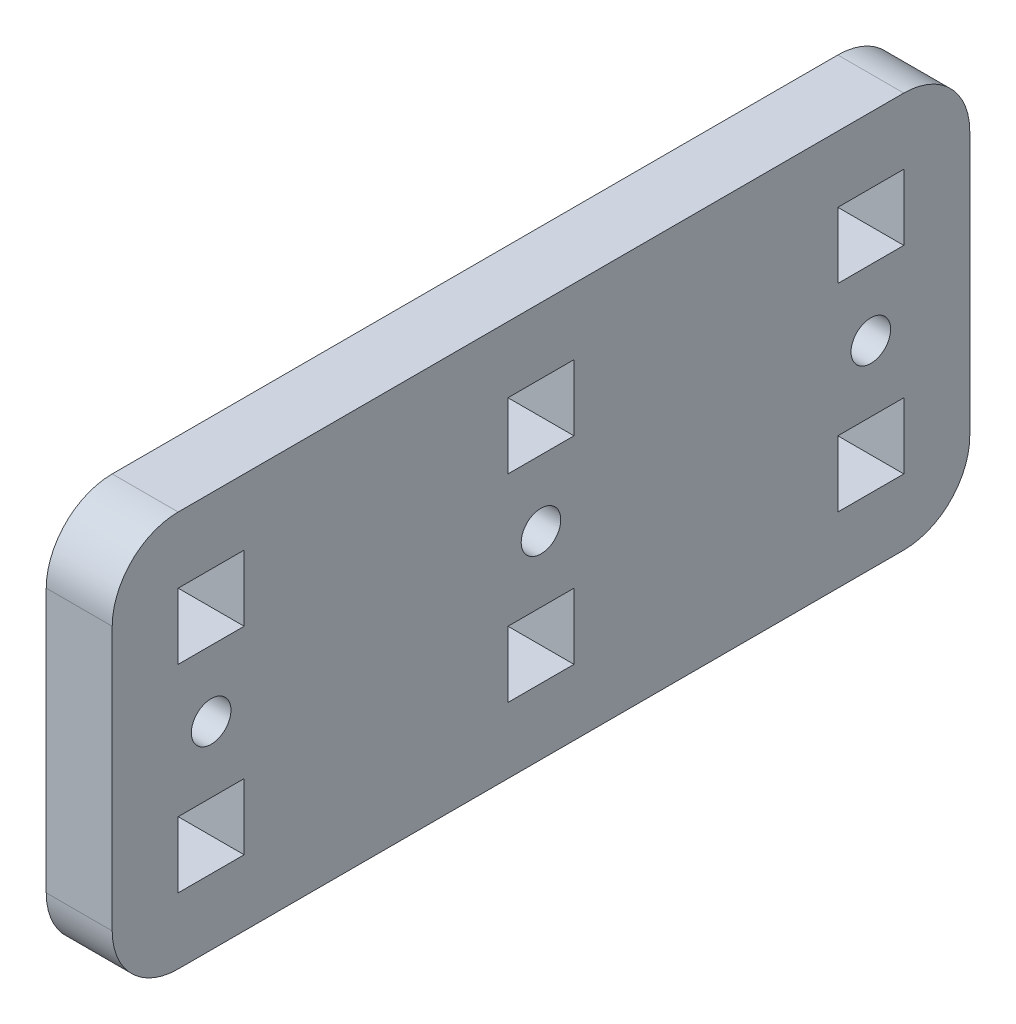
ISO-10303-21;
HEADER;
FILE_DESCRIPTION(('STEP AP214'),'2;1');
FILE_NAME('part.step','',(''),(''),'','','');
FILE_SCHEMA(('AUTOMOTIVE_DESIGN { 1 0 10303 214 1 1 1 1 }'));
ENDSEC;
DATA;
#1=APPLICATION_CONTEXT('core data for automotive mechanical design processes');
#2=APPLICATION_PROTOCOL_DEFINITION('international standard','automotive_design',2000,#1);
#3=PRODUCT_CONTEXT('',#1,'mechanical');
#4=PRODUCT('Part','Part','',(#3));
#5=PRODUCT_RELATED_PRODUCT_CATEGORY('part','',(#4));
#6=PRODUCT_DEFINITION_FORMATION('','',#4);
#7=PRODUCT_DEFINITION_CONTEXT('part definition',#1,'design');
#8=PRODUCT_DEFINITION('design','',#6,#7);
#9=PRODUCT_DEFINITION_SHAPE('','',#8);
#10=(LENGTH_UNIT() NAMED_UNIT(*) SI_UNIT(.MILLI.,.METRE.));
#11=(NAMED_UNIT(*) PLANE_ANGLE_UNIT() SI_UNIT($,.RADIAN.));
#12=(NAMED_UNIT(*) SI_UNIT($,.STERADIAN.) SOLID_ANGLE_UNIT());
#13=UNCERTAINTY_MEASURE_WITH_UNIT(LENGTH_MEASURE(1.E-05),#10,'distance_accuracy_value','');
#14=(GEOMETRIC_REPRESENTATION_CONTEXT(3) GLOBAL_UNCERTAINTY_ASSIGNED_CONTEXT((#13)) GLOBAL_UNIT_ASSIGNED_CONTEXT((#10,
#11,#12)) REPRESENTATION_CONTEXT('',''));
#15=CARTESIAN_POINT('',(0.,0.,0.));
#16=DIRECTION('',(0.,0.,1.));
#17=DIRECTION('',(1.,0.,0.));
#18=AXIS2_PLACEMENT_3D('',#15,#16,#17);
#19=CARTESIAN_POINT('',(5.,0.,0.));
#20=DIRECTION('',(-1.,0.,0.));
#21=DIRECTION('',(0.,0.,1.));
#22=AXIS2_PLACEMENT_3D('',#19,#20,#21);
#23=PLANE('',#22);
#24=DIRECTION('',(0.,0.,-1.));
#25=VECTOR('',#24,1.);
#26=CARTESIAN_POINT('',(4.99999999999997,20.,-30.));
#27=LINE('',#26,#25);
#28=CARTESIAN_POINT('',(4.99999999999997,20.,-30.));
#29=VERTEX_POINT('',#28);
#30=CARTESIAN_POINT('',(5.,20.,-35.));
#31=VERTEX_POINT('',#30);
#32=EDGE_CURVE('E287',#29,#31,#27,.T.);
#33=ORIENTED_EDGE('',*,*,#32,.F.);
#34=DIRECTION('',(0.,-1.,0.));
#35=VECTOR('',#34,1.);
#36=CARTESIAN_POINT('',(4.99999999999997,20.,-30.));
#37=LINE('',#36,#35);
#38=CARTESIAN_POINT('',(5.,25.,-30.));
#39=VERTEX_POINT('',#38);
#40=EDGE_CURVE('E295',#39,#29,#37,.T.);
#41=ORIENTED_EDGE('',*,*,#40,.F.);
#42=DIRECTION('',(0.,0.,1.));
#43=VECTOR('',#42,1.);
#44=CARTESIAN_POINT('',(4.99999999999997,25.,-30.));
#45=LINE('',#44,#43);
#46=CARTESIAN_POINT('',(5.,25.,-35.));
#47=VERTEX_POINT('',#46);
#48=EDGE_CURVE('E292',#47,#39,#45,.T.);
#49=ORIENTED_EDGE('',*,*,#48,.F.);
#50=DIRECTION('',(0.,1.,0.));
#51=VECTOR('',#50,1.);
#52=CARTESIAN_POINT('',(5.,20.,-35.));
#53=LINE('',#52,#51);
#54=EDGE_CURVE('E289',#31,#47,#53,.T.);
#55=ORIENTED_EDGE('',*,*,#54,.F.);
#56=EDGE_LOOP('',(#33,#41,#49,#55));
#57=FACE_BOUND('',#56,.T.);
#58=DIRECTION('',(0.,0.,-1.));
#59=VECTOR('',#58,1.);
#60=CARTESIAN_POINT('',(5.00000000000002,20.,-55.));
#61=LINE('',#60,#59);
#62=CARTESIAN_POINT('',(5.00000000000002,20.,-55.));
#63=VERTEX_POINT('',#62);
#64=CARTESIAN_POINT('',(5.00000000000005,20.,-60.));
#65=VERTEX_POINT('',#64);
#66=EDGE_CURVE('E355',#63,#65,#61,.T.);
#67=ORIENTED_EDGE('',*,*,#66,.F.);
#68=DIRECTION('',(0.,-1.,0.));
#69=VECTOR('',#68,1.);
#70=CARTESIAN_POINT('',(5.00000000000002,20.,-55.));
#71=LINE('',#70,#69);
#72=CARTESIAN_POINT('',(5.,25.,-55.));
#73=VERTEX_POINT('',#72);
#74=EDGE_CURVE('E363',#73,#63,#71,.T.);
#75=ORIENTED_EDGE('',*,*,#74,.F.);
#76=DIRECTION('',(0.,0.,1.));
#77=VECTOR('',#76,1.);
#78=CARTESIAN_POINT('',(5.00000000000002,25.,-55.));
#79=LINE('',#78,#77);
#80=CARTESIAN_POINT('',(5.00000000000005,25.,-60.));
#81=VERTEX_POINT('',#80);
#82=EDGE_CURVE('E360',#81,#73,#79,.T.);
#83=ORIENTED_EDGE('',*,*,#82,.F.);
#84=DIRECTION('',(0.,1.,0.));
#85=VECTOR('',#84,1.);
#86=CARTESIAN_POINT('',(5.00000000000005,20.,-60.));
#87=LINE('',#86,#85);
#88=EDGE_CURVE('E357',#65,#81,#87,.T.);
#89=ORIENTED_EDGE('',*,*,#88,.F.);
#90=EDGE_LOOP('',(#67,#75,#83,#89));
#91=FACE_BOUND('',#90,.T.);
#92=DIRECTION('',(0.,0.,-1.));
#93=VECTOR('',#92,1.);
#94=CARTESIAN_POINT('',(5.,20.,-10.));
#95=LINE('',#94,#93);
#96=CARTESIAN_POINT('',(5.,20.,-5.));
#97=VERTEX_POINT('',#96);
#98=CARTESIAN_POINT('',(5.,20.,-10.));
#99=VERTEX_POINT('',#98);
#100=EDGE_CURVE('E423',#97,#99,#95,.T.);
#101=ORIENTED_EDGE('',*,*,#100,.F.);
#102=DIRECTION('',(0.,-1.,0.));
#103=VECTOR('',#102,1.);
#104=CARTESIAN_POINT('',(5.,20.,-5.));
#105=LINE('',#104,#103);
#106=CARTESIAN_POINT('',(5.,25.,-5.));
#107=VERTEX_POINT('',#106);
#108=EDGE_CURVE('E431',#107,#97,#105,.T.);
#109=ORIENTED_EDGE('',*,*,#108,.F.);
#110=DIRECTION('',(0.,0.,1.));
#111=VECTOR('',#110,1.);
#112=CARTESIAN_POINT('',(5.,25.,-10.));
#113=LINE('',#112,#111);
#114=CARTESIAN_POINT('',(5.,25.,-10.));
#115=VERTEX_POINT('',#114);
#116=EDGE_CURVE('E428',#115,#107,#113,.T.);
#117=ORIENTED_EDGE('',*,*,#116,.F.);
#118=DIRECTION('',(0.,1.,0.));
#119=VECTOR('',#118,1.);
#120=CARTESIAN_POINT('',(5.,20.,-10.));
#121=LINE('',#120,#119);
#122=EDGE_CURVE('E425',#99,#115,#121,.T.);
#123=ORIENTED_EDGE('',*,*,#122,.F.);
#124=EDGE_LOOP('',(#101,#109,#117,#123));
#125=FACE_BOUND('',#124,.T.);
#126=DIRECTION('',(0.,0.,-1.));
#127=VECTOR('',#126,1.);
#128=CARTESIAN_POINT('',(5.,0.,0.));
#129=LINE('',#128,#127);
#130=CARTESIAN_POINT('',(5.,0.,-5.));
#131=VERTEX_POINT('',#130);
#132=CARTESIAN_POINT('',(5.,0.,-60.));
#133=VERTEX_POINT('',#132);
#134=EDGE_CURVE('E457',#131,#133,#129,.T.);
#135=ORIENTED_EDGE('',*,*,#134,.T.);
#136=CARTESIAN_POINT('',(5.,5.00000000000001,-60.));
#137=DIRECTION('',(-1.,0.,0.));
#138=DIRECTION('',(0.,0.,1.));
#139=AXIS2_PLACEMENT_3D('',#136,#137,#138);
#140=CIRCLE('',#139,5.);
#141=CARTESIAN_POINT('',(5.,5.00000000000001,-65.));
#142=VERTEX_POINT('',#141);
#143=EDGE_CURVE('E497',#133,#142,#140,.F.);
#144=ORIENTED_EDGE('',*,*,#143,.T.);
#145=DIRECTION('',(0.,1.,0.));
#146=VECTOR('',#145,1.);
#147=CARTESIAN_POINT('',(5.,0.,-65.));
#148=LINE('',#147,#146);
#149=CARTESIAN_POINT('',(5.,25.,-65.));
#150=VERTEX_POINT('',#149);
#151=EDGE_CURVE('E461',#142,#150,#148,.T.);
#152=ORIENTED_EDGE('',*,*,#151,.T.);
#153=CARTESIAN_POINT('',(5.,25.,-60.));
#154=DIRECTION('',(-1.,0.,0.));
#155=DIRECTION('',(0.,0.,1.));
#156=AXIS2_PLACEMENT_3D('',#153,#154,#155);
#157=CIRCLE('',#156,5.);
#158=CARTESIAN_POINT('',(5.,30.,-60.));
#159=VERTEX_POINT('',#158);
#160=EDGE_CURVE('E54',#150,#159,#157,.F.);
#161=ORIENTED_EDGE('',*,*,#160,.T.);
#162=DIRECTION('',(0.,0.,1.));
#163=VECTOR('',#162,1.);
#164=CARTESIAN_POINT('',(5.,30.,0.));
#165=LINE('',#164,#163);
#166=CARTESIAN_POINT('',(5.,30.,-5.));
#167=VERTEX_POINT('',#166);
#168=EDGE_CURVE('E463',#159,#167,#165,.T.);
#169=ORIENTED_EDGE('',*,*,#168,.T.);
#170=CARTESIAN_POINT('',(5.,25.,-5.));
#171=DIRECTION('',(-1.,0.,0.));
#172=DIRECTION('',(0.,0.,1.));
#173=AXIS2_PLACEMENT_3D('',#170,#171,#172);
#174=CIRCLE('',#173,5.);
#175=CARTESIAN_POINT('',(5.,25.,0.));
#176=VERTEX_POINT('',#175);
#177=EDGE_CURVE('E492',#167,#176,#174,.F.);
#178=ORIENTED_EDGE('',*,*,#177,.T.);
#179=DIRECTION('',(0.,-1.,0.));
#180=VECTOR('',#179,1.);
#181=CARTESIAN_POINT('',(5.,0.,0.));
#182=LINE('',#181,#180);
#183=CARTESIAN_POINT('',(5.,5.,0.));
#184=VERTEX_POINT('',#183);
#185=EDGE_CURVE('E454',#176,#184,#182,.T.);
#186=ORIENTED_EDGE('',*,*,#185,.T.);
#187=CARTESIAN_POINT('',(5.,5.,-5.));
#188=DIRECTION('',(-1.,0.,0.));
#189=DIRECTION('',(0.,0.,1.));
#190=AXIS2_PLACEMENT_3D('',#187,#188,#189);
#191=CIRCLE('',#190,5.);
#192=EDGE_CURVE('E494',#184,#131,#191,.F.);
#193=ORIENTED_EDGE('',*,*,#192,.T.);
#194=EDGE_LOOP('',(#135,#144,#152,#161,#169,#178,#186,#193));
#195=FACE_BOUND('',#194,.T.);
#196=DIRECTION('',(0.,0.,1.));
#197=VECTOR('',#196,1.);
#198=CARTESIAN_POINT('',(5.,10.,-10.));
#199=LINE('',#198,#197);
#200=CARTESIAN_POINT('',(5.,10.,-10.));
#201=VERTEX_POINT('',#200);
#202=CARTESIAN_POINT('',(5.,10.,-5.));
#203=VERTEX_POINT('',#202);
#204=EDGE_CURVE('E392',#201,#203,#199,.T.);
#205=ORIENTED_EDGE('',*,*,#204,.F.);
#206=DIRECTION('',(0.,1.,0.));
#207=VECTOR('',#206,1.);
#208=CARTESIAN_POINT('',(5.,10.,-10.));
#209=LINE('',#208,#207);
#210=CARTESIAN_POINT('',(5.,5.,-10.));
#211=VERTEX_POINT('',#210);
#212=EDGE_CURVE('E400',#211,#201,#209,.T.);
#213=ORIENTED_EDGE('',*,*,#212,.F.);
#214=DIRECTION('',(0.,0.,-1.));
#215=VECTOR('',#214,1.);
#216=CARTESIAN_POINT('',(5.,5.,-10.));
#217=LINE('',#216,#215);
#218=CARTESIAN_POINT('',(5.,5.,-5.));
#219=VERTEX_POINT('',#218);
#220=EDGE_CURVE('E397',#219,#211,#217,.T.);
#221=ORIENTED_EDGE('',*,*,#220,.F.);
#222=DIRECTION('',(0.,-1.,0.));
#223=VECTOR('',#222,1.);
#224=CARTESIAN_POINT('',(5.,10.,-5.));
#225=LINE('',#224,#223);
#226=EDGE_CURVE('E394',#203,#219,#225,.T.);
#227=ORIENTED_EDGE('',*,*,#226,.F.);
#228=EDGE_LOOP('',(#205,#213,#221,#227));
#229=FACE_BOUND('',#228,.T.);
#230=CARTESIAN_POINT('',(5.,15.,-7.5));
#231=DIRECTION('',(1.,0.,0.));
#232=DIRECTION('',(0.,0.,-1.));
#233=AXIS2_PLACEMENT_3D('',#230,#231,#232);
#234=CIRCLE('',#233,1.5);
#235=CARTESIAN_POINT('',(5.,15.,-9.));
#236=VERTEX_POINT('',#235);
#237=EDGE_CURVE('E386',#236,#236,#234,.T.);
#238=ORIENTED_EDGE('',*,*,#237,.F.);
#239=EDGE_LOOP('',(#238));
#240=FACE_BOUND('',#239,.T.);
#241=DIRECTION('',(0.,0.,1.));
#242=VECTOR('',#241,1.);
#243=CARTESIAN_POINT('',(5.00000000000002,10.,-55.));
#244=LINE('',#243,#242);
#245=CARTESIAN_POINT('',(5.00000000000005,10.,-60.));
#246=VERTEX_POINT('',#245);
#247=CARTESIAN_POINT('',(5.00000000000002,10.,-55.));
#248=VERTEX_POINT('',#247);
#249=EDGE_CURVE('E324',#246,#248,#244,.T.);
#250=ORIENTED_EDGE('',*,*,#249,.F.);
#251=DIRECTION('',(0.,1.,0.));
#252=VECTOR('',#251,1.);
#253=CARTESIAN_POINT('',(5.00000000000005,10.,-60.));
#254=LINE('',#253,#252);
#255=CARTESIAN_POINT('',(5.,5.,-60.));
#256=VERTEX_POINT('',#255);
#257=EDGE_CURVE('E332',#256,#246,#254,.T.);
#258=ORIENTED_EDGE('',*,*,#257,.F.);
#259=DIRECTION('',(0.,0.,-1.));
#260=VECTOR('',#259,1.);
#261=CARTESIAN_POINT('',(5.00000000000002,5.,-55.));
#262=LINE('',#261,#260);
#263=CARTESIAN_POINT('',(5.00000000000002,5.,-55.));
#264=VERTEX_POINT('',#263);
#265=EDGE_CURVE('E329',#264,#256,#262,.T.);
#266=ORIENTED_EDGE('',*,*,#265,.F.);
#267=DIRECTION('',(0.,-1.,0.));
#268=VECTOR('',#267,1.);
#269=CARTESIAN_POINT('',(5.00000000000002,10.,-55.));
#270=LINE('',#269,#268);
#271=EDGE_CURVE('E326',#248,#264,#270,.T.);
#272=ORIENTED_EDGE('',*,*,#271,.F.);
#273=EDGE_LOOP('',(#250,#258,#266,#272));
#274=FACE_BOUND('',#273,.T.);
#275=CARTESIAN_POINT('',(5.00000000000003,15.,-57.5));
#276=DIRECTION('',(1.,0.,0.));
#277=DIRECTION('',(0.,0.,1.));
#278=AXIS2_PLACEMENT_3D('',#275,#276,#277);
#279=CIRCLE('',#278,1.5);
#280=CARTESIAN_POINT('',(5.00000000000002,15.,-56.));
#281=VERTEX_POINT('',#280);
#282=EDGE_CURVE('E318',#281,#281,#279,.T.);
#283=ORIENTED_EDGE('',*,*,#282,.F.);
#284=EDGE_LOOP('',(#283));
#285=FACE_BOUND('',#284,.T.);
#286=DIRECTION('',(0.,0.,1.));
#287=VECTOR('',#286,1.);
#288=CARTESIAN_POINT('',(4.99999999999997,10.,-30.));
#289=LINE('',#288,#287);
#290=CARTESIAN_POINT('',(5.,10.,-35.));
#291=VERTEX_POINT('',#290);
#292=CARTESIAN_POINT('',(4.99999999999997,10.,-30.));
#293=VERTEX_POINT('',#292);
#294=EDGE_CURVE('E243',#291,#293,#289,.T.);
#295=ORIENTED_EDGE('',*,*,#294,.F.);
#296=DIRECTION('',(0.,1.,0.));
#297=VECTOR('',#296,1.);
#298=CARTESIAN_POINT('',(5.,10.,-35.));
#299=LINE('',#298,#297);
#300=CARTESIAN_POINT('',(5.,5.,-35.));
#301=VERTEX_POINT('',#300);
#302=EDGE_CURVE('E269',#301,#291,#299,.T.);
#303=ORIENTED_EDGE('',*,*,#302,.F.);
#304=DIRECTION('',(0.,0.,-1.));
#305=VECTOR('',#304,1.);
#306=CARTESIAN_POINT('',(4.99999999999997,5.,-30.));
#307=LINE('',#306,#305);
#308=CARTESIAN_POINT('',(4.99999999999997,5.,-30.));
#309=VERTEX_POINT('',#308);
#310=EDGE_CURVE('E267',#309,#301,#307,.T.);
#311=ORIENTED_EDGE('',*,*,#310,.F.);
#312=DIRECTION('',(0.,-1.,0.));
#313=VECTOR('',#312,1.);
#314=CARTESIAN_POINT('',(4.99999999999997,10.,-30.));
#315=LINE('',#314,#313);
#316=EDGE_CURVE('E253',#293,#309,#315,.T.);
#317=ORIENTED_EDGE('',*,*,#316,.F.);
#318=EDGE_LOOP('',(#295,#303,#311,#317));
#319=FACE_BOUND('',#318,.T.);
#320=CARTESIAN_POINT('',(4.99999999999998,15.,-32.5));
#321=DIRECTION('',(1.,0.,0.));
#322=DIRECTION('',(0.,0.,1.));
#323=AXIS2_PLACEMENT_3D('',#320,#321,#322);
#324=CIRCLE('',#323,1.5);
#325=CARTESIAN_POINT('',(4.99999999999997,15.,-31.));
#326=VERTEX_POINT('',#325);
#327=EDGE_CURVE('E276',#326,#326,#324,.T.);
#328=ORIENTED_EDGE('',*,*,#327,.F.);
#329=EDGE_LOOP('',(#328));
#330=FACE_BOUND('',#329,.T.);
#331=ADVANCED_FACE('F32',(#57,#91,#125,#195,#229,#240,#274,#285,#319,#330),#23,.F.);
#332=CARTESIAN_POINT('',(0.,0.,0.));
#333=DIRECTION('',(-1.,0.,0.));
#334=DIRECTION('',(0.,0.,1.));
#335=AXIS2_PLACEMENT_3D('',#332,#333,#334);
#336=PLANE('',#335);
#337=DIRECTION('',(0.,1.,0.));
#338=VECTOR('',#337,1.);
#339=CARTESIAN_POINT('',(0.,10.,-35.));
#340=LINE('',#339,#338);
#341=CARTESIAN_POINT('',(0.,5.,-35.));
#342=VERTEX_POINT('',#341);
#343=CARTESIAN_POINT('',(0.,10.,-35.));
#344=VERTEX_POINT('',#343);
#345=EDGE_CURVE('E254',#342,#344,#340,.T.);
#346=ORIENTED_EDGE('',*,*,#345,.T.);
#347=DIRECTION('',(0.,0.,1.));
#348=VECTOR('',#347,1.);
#349=CARTESIAN_POINT('',(0.,10.,-30.));
#350=LINE('',#349,#348);
#351=CARTESIAN_POINT('',(0.,10.,-30.));
#352=VERTEX_POINT('',#351);
#353=EDGE_CURVE('E274',#344,#352,#350,.T.);
#354=ORIENTED_EDGE('',*,*,#353,.T.);
#355=DIRECTION('',(0.,-1.,0.));
#356=VECTOR('',#355,1.);
#357=CARTESIAN_POINT('',(0.,10.,-30.));
#358=LINE('',#357,#356);
#359=CARTESIAN_POINT('',(0.,5.,-30.));
#360=VERTEX_POINT('',#359);
#361=EDGE_CURVE('E260',#352,#360,#358,.T.);
#362=ORIENTED_EDGE('',*,*,#361,.T.);
#363=DIRECTION('',(0.,0.,-1.));
#364=VECTOR('',#363,1.);
#365=CARTESIAN_POINT('',(0.,5.,-30.));
#366=LINE('',#365,#364);
#367=EDGE_CURVE('E278',#360,#342,#366,.T.);
#368=ORIENTED_EDGE('',*,*,#367,.T.);
#369=EDGE_LOOP('',(#346,#354,#362,#368));
#370=FACE_BOUND('',#369,.T.);
#371=DIRECTION('',(0.,-1.,0.));
#372=VECTOR('',#371,1.);
#373=CARTESIAN_POINT('',(0.,20.,-30.));
#374=LINE('',#373,#372);
#375=CARTESIAN_POINT('',(0.,25.,-30.));
#376=VERTEX_POINT('',#375);
#377=CARTESIAN_POINT('',(0.,20.,-30.));
#378=VERTEX_POINT('',#377);
#379=EDGE_CURVE('E290',#376,#378,#374,.T.);
#380=ORIENTED_EDGE('',*,*,#379,.T.);
#381=DIRECTION('',(0.,0.,-1.));
#382=VECTOR('',#381,1.);
#383=CARTESIAN_POINT('',(0.,20.,-30.));
#384=LINE('',#383,#382);
#385=CARTESIAN_POINT('',(0.,20.,-35.));
#386=VERTEX_POINT('',#385);
#387=EDGE_CURVE('E261',#378,#386,#384,.T.);
#388=ORIENTED_EDGE('',*,*,#387,.T.);
#389=DIRECTION('',(0.,1.,0.));
#390=VECTOR('',#389,1.);
#391=CARTESIAN_POINT('',(0.,20.,-35.));
#392=LINE('',#391,#390);
#393=CARTESIAN_POINT('',(0.,25.,-35.));
#394=VERTEX_POINT('',#393);
#395=EDGE_CURVE('E300',#386,#394,#392,.T.);
#396=ORIENTED_EDGE('',*,*,#395,.T.);
#397=DIRECTION('',(0.,0.,1.));
#398=VECTOR('',#397,1.);
#399=CARTESIAN_POINT('',(0.,25.,-30.));
#400=LINE('',#399,#398);
#401=EDGE_CURVE('E303',#394,#376,#400,.T.);
#402=ORIENTED_EDGE('',*,*,#401,.T.);
#403=EDGE_LOOP('',(#380,#388,#396,#402));
#404=FACE_BOUND('',#403,.T.);
#405=CARTESIAN_POINT('',(0.,15.,-57.5));
#406=DIRECTION('',(1.,0.,0.));
#407=DIRECTION('',(0.,0.,1.));
#408=AXIS2_PLACEMENT_3D('',#405,#406,#407);
#409=CIRCLE('',#408,1.5);
#410=CARTESIAN_POINT('',(0.,15.,-56.));
#411=VERTEX_POINT('',#410);
#412=EDGE_CURVE('E317',#411,#411,#409,.T.);
#413=ORIENTED_EDGE('',*,*,#412,.T.);
#414=EDGE_LOOP('',(#413));
#415=FACE_BOUND('',#414,.T.);
#416=DIRECTION('',(0.,1.,0.));
#417=VECTOR('',#416,1.);
#418=CARTESIAN_POINT('',(0.,10.,-10.));
#419=LINE('',#418,#417);
#420=CARTESIAN_POINT('',(0.,5.,-10.));
#421=VERTEX_POINT('',#420);
#422=CARTESIAN_POINT('',(0.,10.,-10.));
#423=VERTEX_POINT('',#422);
#424=EDGE_CURVE('E395',#421,#423,#419,.T.);
#425=ORIENTED_EDGE('',*,*,#424,.T.);
#426=DIRECTION('',(0.,0.,1.));
#427=VECTOR('',#426,1.);
#428=CARTESIAN_POINT('',(0.,10.,-10.));
#429=LINE('',#428,#427);
#430=CARTESIAN_POINT('',(0.,10.,-5.));
#431=VERTEX_POINT('',#430);
#432=EDGE_CURVE('E389',#423,#431,#429,.T.);
#433=ORIENTED_EDGE('',*,*,#432,.T.);
#434=DIRECTION('',(0.,-1.,0.));
#435=VECTOR('',#434,1.);
#436=CARTESIAN_POINT('',(0.,10.,-5.));
#437=LINE('',#436,#435);
#438=CARTESIAN_POINT('',(0.,5.,-5.));
#439=VERTEX_POINT('',#438);
#440=EDGE_CURVE('E405',#431,#439,#437,.T.);
#441=ORIENTED_EDGE('',*,*,#440,.T.);
#442=DIRECTION('',(0.,0.,-1.));
#443=VECTOR('',#442,1.);
#444=CARTESIAN_POINT('',(0.,5.,-10.));
#445=LINE('',#444,#443);
#446=EDGE_CURVE('E408',#439,#421,#445,.T.);
#447=ORIENTED_EDGE('',*,*,#446,.T.);
#448=EDGE_LOOP('',(#425,#433,#441,#447));
#449=FACE_BOUND('',#448,.T.);
#450=DIRECTION('',(0.,-1.,0.));
#451=VECTOR('',#450,1.);
#452=CARTESIAN_POINT('',(0.,20.,-5.));
#453=LINE('',#452,#451);
#454=CARTESIAN_POINT('',(0.,25.,-5.));
#455=VERTEX_POINT('',#454);
#456=CARTESIAN_POINT('',(0.,20.,-5.));
#457=VERTEX_POINT('',#456);
#458=EDGE_CURVE('E426',#455,#457,#453,.T.);
#459=ORIENTED_EDGE('',*,*,#458,.T.);
#460=DIRECTION('',(0.,0.,-1.));
#461=VECTOR('',#460,1.);
#462=CARTESIAN_POINT('',(0.,20.,-10.));
#463=LINE('',#462,#461);
#464=CARTESIAN_POINT('',(0.,20.,-10.));
#465=VERTEX_POINT('',#464);
#466=EDGE_CURVE('E422',#457,#465,#463,.T.);
#467=ORIENTED_EDGE('',*,*,#466,.T.);
#468=DIRECTION('',(0.,1.,0.));
#469=VECTOR('',#468,1.);
#470=CARTESIAN_POINT('',(0.,20.,-10.));
#471=LINE('',#470,#469);
#472=CARTESIAN_POINT('',(0.,25.,-10.));
#473=VERTEX_POINT('',#472);
#474=EDGE_CURVE('E436',#465,#473,#471,.T.);
#475=ORIENTED_EDGE('',*,*,#474,.T.);
#476=DIRECTION('',(0.,0.,1.));
#477=VECTOR('',#476,1.);
#478=CARTESIAN_POINT('',(0.,25.,-10.));
#479=LINE('',#478,#477);
#480=EDGE_CURVE('E439',#473,#455,#479,.T.);
#481=ORIENTED_EDGE('',*,*,#480,.T.);
#482=EDGE_LOOP('',(#459,#467,#475,#481));
#483=FACE_BOUND('',#482,.T.);
#484=DIRECTION('',(0.,1.,0.));
#485=VECTOR('',#484,1.);
#486=CARTESIAN_POINT('',(0.,0.,-65.));
#487=LINE('',#486,#485);
#488=CARTESIAN_POINT('',(0.,5.00000000000001,-65.));
#489=VERTEX_POINT('',#488);
#490=CARTESIAN_POINT('',(0.,25.,-65.));
#491=VERTEX_POINT('',#490);
#492=EDGE_CURVE('E471',#489,#491,#487,.T.);
#493=ORIENTED_EDGE('',*,*,#492,.F.);
#494=CARTESIAN_POINT('',(0.,5.00000000000001,-60.));
#495=DIRECTION('',(-1.,0.,0.));
#496=DIRECTION('',(0.,0.,1.));
#497=AXIS2_PLACEMENT_3D('',#494,#495,#496);
#498=CIRCLE('',#497,5.);
#499=CARTESIAN_POINT('',(0.,0.,-60.));
#500=VERTEX_POINT('',#499);
#501=EDGE_CURVE('E485',#489,#500,#498,.T.);
#502=ORIENTED_EDGE('',*,*,#501,.T.);
#503=DIRECTION('',(0.,0.,-1.));
#504=VECTOR('',#503,1.);
#505=CARTESIAN_POINT('',(0.,0.,0.));
#506=LINE('',#505,#504);
#507=CARTESIAN_POINT('',(0.,0.,-5.));
#508=VERTEX_POINT('',#507);
#509=EDGE_CURVE('E468',#508,#500,#506,.T.);
#510=ORIENTED_EDGE('',*,*,#509,.F.);
#511=CARTESIAN_POINT('',(0.,5.,-5.));
#512=DIRECTION('',(-1.,0.,0.));
#513=DIRECTION('',(0.,0.,1.));
#514=AXIS2_PLACEMENT_3D('',#511,#512,#513);
#515=CIRCLE('',#514,5.);
#516=CARTESIAN_POINT('',(0.,5.,0.));
#517=VERTEX_POINT('',#516);
#518=EDGE_CURVE('E481',#508,#517,#515,.T.);
#519=ORIENTED_EDGE('',*,*,#518,.T.);
#520=DIRECTION('',(0.,-1.,0.));
#521=VECTOR('',#520,1.);
#522=CARTESIAN_POINT('',(0.,0.,0.));
#523=LINE('',#522,#521);
#524=CARTESIAN_POINT('',(0.,25.,0.));
#525=VERTEX_POINT('',#524);
#526=EDGE_CURVE('E453',#525,#517,#523,.T.);
#527=ORIENTED_EDGE('',*,*,#526,.F.);
#528=CARTESIAN_POINT('',(0.,25.,-5.));
#529=DIRECTION('',(-1.,0.,0.));
#530=DIRECTION('',(0.,0.,1.));
#531=AXIS2_PLACEMENT_3D('',#528,#529,#530);
#532=CIRCLE('',#531,5.);
#533=CARTESIAN_POINT('',(0.,30.,-5.));
#534=VERTEX_POINT('',#533);
#535=EDGE_CURVE('E479',#525,#534,#532,.T.);
#536=ORIENTED_EDGE('',*,*,#535,.T.);
#537=DIRECTION('',(0.,0.,1.));
#538=VECTOR('',#537,1.);
#539=CARTESIAN_POINT('',(0.,30.,0.));
#540=LINE('',#539,#538);
#541=CARTESIAN_POINT('',(0.,30.,-60.));
#542=VERTEX_POINT('',#541);
#543=EDGE_CURVE('E458',#542,#534,#540,.T.);
#544=ORIENTED_EDGE('',*,*,#543,.F.);
#545=CARTESIAN_POINT('',(0.,25.,-60.));
#546=DIRECTION('',(-1.,0.,0.));
#547=DIRECTION('',(0.,0.,1.));
#548=AXIS2_PLACEMENT_3D('',#545,#546,#547);
#549=CIRCLE('',#548,5.);
#550=EDGE_CURVE('E483',#542,#491,#549,.T.);
#551=ORIENTED_EDGE('',*,*,#550,.T.);
#552=EDGE_LOOP('',(#493,#502,#510,#519,#527,#536,#544,#551));
#553=FACE_BOUND('',#552,.T.);
#554=CARTESIAN_POINT('',(0.,15.,-7.5));
#555=DIRECTION('',(1.,0.,0.));
#556=DIRECTION('',(0.,0.,-1.));
#557=AXIS2_PLACEMENT_3D('',#554,#555,#556);
#558=CIRCLE('',#557,1.5);
#559=CARTESIAN_POINT('',(0.,15.,-9.));
#560=VERTEX_POINT('',#559);
#561=EDGE_CURVE('E385',#560,#560,#558,.T.);
#562=ORIENTED_EDGE('',*,*,#561,.T.);
#563=EDGE_LOOP('',(#562));
#564=FACE_BOUND('',#563,.T.);
#565=DIRECTION('',(0.,-1.,0.));
#566=VECTOR('',#565,1.);
#567=CARTESIAN_POINT('',(0.,20.,-55.));
#568=LINE('',#567,#566);
#569=CARTESIAN_POINT('',(0.,25.,-55.));
#570=VERTEX_POINT('',#569);
#571=CARTESIAN_POINT('',(0.,20.,-55.));
#572=VERTEX_POINT('',#571);
#573=EDGE_CURVE('E358',#570,#572,#568,.T.);
#574=ORIENTED_EDGE('',*,*,#573,.T.);
#575=DIRECTION('',(0.,0.,-1.));
#576=VECTOR('',#575,1.);
#577=CARTESIAN_POINT('',(0.,20.,-55.));
#578=LINE('',#577,#576);
#579=CARTESIAN_POINT('',(0.,20.,-60.));
#580=VERTEX_POINT('',#579);
#581=EDGE_CURVE('E354',#572,#580,#578,.T.);
#582=ORIENTED_EDGE('',*,*,#581,.T.);
#583=DIRECTION('',(0.,1.,0.));
#584=VECTOR('',#583,1.);
#585=CARTESIAN_POINT('',(0.,20.,-60.));
#586=LINE('',#585,#584);
#587=CARTESIAN_POINT('',(0.,25.,-60.));
#588=VERTEX_POINT('',#587);
#589=EDGE_CURVE('E368',#580,#588,#586,.T.);
#590=ORIENTED_EDGE('',*,*,#589,.T.);
#591=DIRECTION('',(0.,0.,1.));
#592=VECTOR('',#591,1.);
#593=CARTESIAN_POINT('',(0.,25.,-55.));
#594=LINE('',#593,#592);
#595=EDGE_CURVE('E371',#588,#570,#594,.T.);
#596=ORIENTED_EDGE('',*,*,#595,.T.);
#597=EDGE_LOOP('',(#574,#582,#590,#596));
#598=FACE_BOUND('',#597,.T.);
#599=DIRECTION('',(0.,1.,0.));
#600=VECTOR('',#599,1.);
#601=CARTESIAN_POINT('',(0.,10.,-60.));
#602=LINE('',#601,#600);
#603=CARTESIAN_POINT('',(0.,5.,-60.));
#604=VERTEX_POINT('',#603);
#605=CARTESIAN_POINT('',(0.,10.,-60.));
#606=VERTEX_POINT('',#605);
#607=EDGE_CURVE('E327',#604,#606,#602,.T.);
#608=ORIENTED_EDGE('',*,*,#607,.T.);
#609=DIRECTION('',(0.,0.,1.));
#610=VECTOR('',#609,1.);
#611=CARTESIAN_POINT('',(0.,10.,-55.));
#612=LINE('',#611,#610);
#613=CARTESIAN_POINT('',(0.,10.,-55.));
#614=VERTEX_POINT('',#613);
#615=EDGE_CURVE('E321',#606,#614,#612,.T.);
#616=ORIENTED_EDGE('',*,*,#615,.T.);
#617=DIRECTION('',(0.,-1.,0.));
#618=VECTOR('',#617,1.);
#619=CARTESIAN_POINT('',(0.,10.,-55.));
#620=LINE('',#619,#618);
#621=CARTESIAN_POINT('',(0.,5.,-55.));
#622=VERTEX_POINT('',#621);
#623=EDGE_CURVE('E337',#614,#622,#620,.T.);
#624=ORIENTED_EDGE('',*,*,#623,.T.);
#625=DIRECTION('',(0.,0.,-1.));
#626=VECTOR('',#625,1.);
#627=CARTESIAN_POINT('',(0.,5.,-55.));
#628=LINE('',#627,#626);
#629=EDGE_CURVE('E340',#622,#604,#628,.T.);
#630=ORIENTED_EDGE('',*,*,#629,.T.);
#631=EDGE_LOOP('',(#608,#616,#624,#630));
#632=FACE_BOUND('',#631,.T.);
#633=CARTESIAN_POINT('',(0.,15.,-32.5));
#634=DIRECTION('',(1.,0.,0.));
#635=DIRECTION('',(0.,0.,1.));
#636=AXIS2_PLACEMENT_3D('',#633,#634,#635);
#637=CIRCLE('',#636,1.5);
#638=CARTESIAN_POINT('',(0.,15.,-31.));
#639=VERTEX_POINT('',#638);
#640=EDGE_CURVE('E928',#639,#639,#637,.T.);
#641=ORIENTED_EDGE('',*,*,#640,.T.);
#642=EDGE_LOOP('',(#641));
#643=FACE_BOUND('',#642,.T.);
#644=ADVANCED_FACE('F513',(#370,#404,#415,#449,#483,#553,#564,#598,#632,#643),#336,.T.);
#645=CARTESIAN_POINT('',(5.,0.,0.));
#646=DIRECTION('',(0.,0.,-1.));
#647=DIRECTION('',(0.,1.,0.));
#648=AXIS2_PLACEMENT_3D('',#645,#646,#647);
#649=PLANE('',#648);
#650=ORIENTED_EDGE('',*,*,#526,.T.);
#651=DIRECTION('',(-1.,0.,0.));
#652=VECTOR('',#651,1.);
#653=CARTESIAN_POINT('',(5.,5.,0.));
#654=LINE('',#653,#652);
#655=EDGE_CURVE('E11',#517,#184,#654,.F.);
#656=ORIENTED_EDGE('',*,*,#655,.T.);
#657=ORIENTED_EDGE('',*,*,#185,.F.);
#658=DIRECTION('',(-1.,0.,0.));
#659=VECTOR('',#658,1.);
#660=CARTESIAN_POINT('',(5.,25.,0.));
#661=LINE('',#660,#659);
#662=EDGE_CURVE('E40',#176,#525,#661,.T.);
#663=ORIENTED_EDGE('',*,*,#662,.T.);
#664=EDGE_LOOP('',(#650,#656,#657,#663));
#665=FACE_BOUND('',#664,.T.);
#666=ADVANCED_FACE('F507',(#665),#649,.F.);
#667=CARTESIAN_POINT('',(5.,0.,0.));
#668=DIRECTION('',(0.,1.,0.));
#669=DIRECTION('',(0.,0.,1.));
#670=AXIS2_PLACEMENT_3D('',#667,#668,#669);
#671=PLANE('',#670);
#672=ORIENTED_EDGE('',*,*,#509,.T.);
#673=DIRECTION('',(-1.,0.,0.));
#674=VECTOR('',#673,1.);
#675=CARTESIAN_POINT('',(5.,0.,-60.));
#676=LINE('',#675,#674);
#677=EDGE_CURVE('E490',#500,#133,#676,.F.);
#678=ORIENTED_EDGE('',*,*,#677,.T.);
#679=ORIENTED_EDGE('',*,*,#134,.F.);
#680=DIRECTION('',(-1.,0.,0.));
#681=VECTOR('',#680,1.);
#682=CARTESIAN_POINT('',(5.,0.,-5.));
#683=LINE('',#682,#681);
#684=EDGE_CURVE('E487',#131,#508,#683,.T.);
#685=ORIENTED_EDGE('',*,*,#684,.T.);
#686=EDGE_LOOP('',(#672,#678,#679,#685));
#687=FACE_BOUND('',#686,.T.);
#688=ADVANCED_FACE('F523',(#687),#671,.F.);
#689=CARTESIAN_POINT('',(5.,0.,-65.));
#690=DIRECTION('',(0.,0.,1.));
#691=DIRECTION('',(1.,0.,0.));
#692=AXIS2_PLACEMENT_3D('',#689,#690,#691);
#693=PLANE('',#692);
#694=ORIENTED_EDGE('',*,*,#151,.F.);
#695=DIRECTION('',(-1.,0.,0.));
#696=VECTOR('',#695,1.);
#697=CARTESIAN_POINT('',(5.,5.00000000000001,-65.));
#698=LINE('',#697,#696);
#699=EDGE_CURVE('E476',#142,#489,#698,.T.);
#700=ORIENTED_EDGE('',*,*,#699,.T.);
#701=ORIENTED_EDGE('',*,*,#492,.T.);
#702=DIRECTION('',(-1.,0.,0.));
#703=VECTOR('',#702,1.);
#704=CARTESIAN_POINT('',(5.,25.,-65.));
#705=LINE('',#704,#703);
#706=EDGE_CURVE('E465',#491,#150,#705,.F.);
#707=ORIENTED_EDGE('',*,*,#706,.T.);
#708=EDGE_LOOP('',(#694,#700,#701,#707));
#709=FACE_BOUND('',#708,.T.);
#710=ADVANCED_FACE('F532',(#709),#693,.F.);
#711=CARTESIAN_POINT('',(5.,30.,0.));
#712=DIRECTION('',(0.,-1.,0.));
#713=DIRECTION('',(0.,0.,-1.));
#714=AXIS2_PLACEMENT_3D('',#711,#712,#713);
#715=PLANE('',#714);
#716=ORIENTED_EDGE('',*,*,#168,.F.);
#717=DIRECTION('',(-1.,0.,0.));
#718=VECTOR('',#717,1.);
#719=CARTESIAN_POINT('',(5.,30.,-60.));
#720=LINE('',#719,#718);
#721=EDGE_CURVE('E500',#159,#542,#720,.T.);
#722=ORIENTED_EDGE('',*,*,#721,.T.);
#723=ORIENTED_EDGE('',*,*,#543,.T.);
#724=DIRECTION('',(-1.,0.,0.));
#725=VECTOR('',#724,1.);
#726=CARTESIAN_POINT('',(5.,30.,-5.));
#727=LINE('',#726,#725);
#728=EDGE_CURVE('E47',#534,#167,#727,.F.);
#729=ORIENTED_EDGE('',*,*,#728,.T.);
#730=EDGE_LOOP('',(#716,#722,#723,#729));
#731=FACE_BOUND('',#730,.T.);
#732=ADVANCED_FACE('F537',(#731),#715,.F.);
#733=CARTESIAN_POINT('',(5.,20.,-10.));
#734=DIRECTION('',(0.,1.,0.));
#735=DIRECTION('',(0.,0.,1.));
#736=AXIS2_PLACEMENT_3D('',#733,#734,#735);
#737=PLANE('',#736);
#738=ORIENTED_EDGE('',*,*,#466,.F.);
#739=DIRECTION('',(-1.,0.,0.));
#740=VECTOR('',#739,1.);
#741=CARTESIAN_POINT('',(5.,20.,-5.));
#742=LINE('',#741,#740);
#743=EDGE_CURVE('E433',#97,#457,#742,.T.);
#744=ORIENTED_EDGE('',*,*,#743,.F.);
#745=ORIENTED_EDGE('',*,*,#100,.T.);
#746=DIRECTION('',(-1.,0.,0.));
#747=VECTOR('',#746,1.);
#748=CARTESIAN_POINT('',(5.,20.,-10.));
#749=LINE('',#748,#747);
#750=EDGE_CURVE('E450',#99,#465,#749,.T.);
#751=ORIENTED_EDGE('',*,*,#750,.T.);
#752=EDGE_LOOP('',(#738,#744,#745,#751));
#753=FACE_BOUND('',#752,.T.);
#754=ADVANCED_FACE('F553',(#753),#737,.T.);
#755=CARTESIAN_POINT('',(5.,20.,-10.));
#756=DIRECTION('',(0.,0.,1.));
#757=DIRECTION('',(0.,-1.,0.));
#758=AXIS2_PLACEMENT_3D('',#755,#756,#757);
#759=PLANE('',#758);
#760=ORIENTED_EDGE('',*,*,#474,.F.);
#761=ORIENTED_EDGE('',*,*,#750,.F.);
#762=ORIENTED_EDGE('',*,*,#122,.T.);
#763=DIRECTION('',(-1.,0.,0.));
#764=VECTOR('',#763,1.);
#765=CARTESIAN_POINT('',(5.,25.,-10.));
#766=LINE('',#765,#764);
#767=EDGE_CURVE('E448',#115,#473,#766,.T.);
#768=ORIENTED_EDGE('',*,*,#767,.T.);
#769=EDGE_LOOP('',(#760,#761,#762,#768));
#770=FACE_BOUND('',#769,.T.);
#771=ADVANCED_FACE('F809',(#770),#759,.T.);
#772=CARTESIAN_POINT('',(5.,25.,-10.));
#773=DIRECTION('',(0.,-1.,0.));
#774=DIRECTION('',(0.,0.,-1.));
#775=AXIS2_PLACEMENT_3D('',#772,#773,#774);
#776=PLANE('',#775);
#777=ORIENTED_EDGE('',*,*,#480,.F.);
#778=ORIENTED_EDGE('',*,*,#767,.F.);
#779=ORIENTED_EDGE('',*,*,#116,.T.);
#780=DIRECTION('',(-1.,0.,0.));
#781=VECTOR('',#780,1.);
#782=CARTESIAN_POINT('',(5.,25.,-5.));
#783=LINE('',#782,#781);
#784=EDGE_CURVE('E446',#107,#455,#783,.T.);
#785=ORIENTED_EDGE('',*,*,#784,.T.);
#786=EDGE_LOOP('',(#777,#778,#779,#785));
#787=FACE_BOUND('',#786,.T.);
#788=ADVANCED_FACE('F800',(#787),#776,.T.);
#789=CARTESIAN_POINT('',(5.,20.,-5.));
#790=DIRECTION('',(0.,0.,-1.));
#791=DIRECTION('',(0.,1.,0.));
#792=AXIS2_PLACEMENT_3D('',#789,#790,#791);
#793=PLANE('',#792);
#794=ORIENTED_EDGE('',*,*,#458,.F.);
#795=ORIENTED_EDGE('',*,*,#784,.F.);
#796=ORIENTED_EDGE('',*,*,#108,.T.);
#797=ORIENTED_EDGE('',*,*,#743,.T.);
#798=EDGE_LOOP('',(#794,#795,#796,#797));
#799=FACE_BOUND('',#798,.T.);
#800=ADVANCED_FACE('F791',(#799),#793,.T.);
#801=CARTESIAN_POINT('',(5.,10.,-10.));
#802=DIRECTION('',(0.,-1.,0.));
#803=DIRECTION('',(0.,0.,-1.));
#804=AXIS2_PLACEMENT_3D('',#801,#802,#803);
#805=PLANE('',#804);
#806=ORIENTED_EDGE('',*,*,#432,.F.);
#807=DIRECTION('',(-1.,0.,0.));
#808=VECTOR('',#807,1.);
#809=CARTESIAN_POINT('',(5.,10.,-10.));
#810=LINE('',#809,#808);
#811=EDGE_CURVE('E402',#201,#423,#810,.T.);
#812=ORIENTED_EDGE('',*,*,#811,.F.);
#813=ORIENTED_EDGE('',*,*,#204,.T.);
#814=DIRECTION('',(-1.,0.,0.));
#815=VECTOR('',#814,1.);
#816=CARTESIAN_POINT('',(5.,10.,-5.));
#817=LINE('',#816,#815);
#818=EDGE_CURVE('E419',#203,#431,#817,.T.);
#819=ORIENTED_EDGE('',*,*,#818,.T.);
#820=EDGE_LOOP('',(#806,#812,#813,#819));
#821=FACE_BOUND('',#820,.T.);
#822=ADVANCED_FACE('F782',(#821),#805,.T.);
#823=CARTESIAN_POINT('',(5.,10.,-5.));
#824=DIRECTION('',(0.,0.,-1.));
#825=DIRECTION('',(-1.,0.,0.));
#826=AXIS2_PLACEMENT_3D('',#823,#824,#825);
#827=PLANE('',#826);
#828=ORIENTED_EDGE('',*,*,#440,.F.);
#829=ORIENTED_EDGE('',*,*,#818,.F.);
#830=ORIENTED_EDGE('',*,*,#226,.T.);
#831=DIRECTION('',(-1.,0.,0.));
#832=VECTOR('',#831,1.);
#833=CARTESIAN_POINT('',(5.,5.,-5.));
#834=LINE('',#833,#832);
#835=EDGE_CURVE('E417',#219,#439,#834,.T.);
#836=ORIENTED_EDGE('',*,*,#835,.T.);
#837=EDGE_LOOP('',(#828,#829,#830,#836));
#838=FACE_BOUND('',#837,.T.);
#839=ADVANCED_FACE('F773',(#838),#827,.T.);
#840=CARTESIAN_POINT('',(5.,5.,-10.));
#841=DIRECTION('',(0.,1.,0.));
#842=DIRECTION('',(0.,0.,1.));
#843=AXIS2_PLACEMENT_3D('',#840,#841,#842);
#844=PLANE('',#843);
#845=ORIENTED_EDGE('',*,*,#446,.F.);
#846=ORIENTED_EDGE('',*,*,#835,.F.);
#847=ORIENTED_EDGE('',*,*,#220,.T.);
#848=DIRECTION('',(-1.,0.,0.));
#849=VECTOR('',#848,1.);
#850=CARTESIAN_POINT('',(5.,5.,-10.));
#851=LINE('',#850,#849);
#852=EDGE_CURVE('E415',#211,#421,#851,.T.);
#853=ORIENTED_EDGE('',*,*,#852,.T.);
#854=EDGE_LOOP('',(#845,#846,#847,#853));
#855=FACE_BOUND('',#854,.T.);
#856=ADVANCED_FACE('F764',(#855),#844,.T.);
#857=CARTESIAN_POINT('',(5.,10.,-10.));
#858=DIRECTION('',(0.,0.,1.));
#859=DIRECTION('',(1.,0.,0.));
#860=AXIS2_PLACEMENT_3D('',#857,#858,#859);
#861=PLANE('',#860);
#862=ORIENTED_EDGE('',*,*,#424,.F.);
#863=ORIENTED_EDGE('',*,*,#852,.F.);
#864=ORIENTED_EDGE('',*,*,#212,.T.);
#865=ORIENTED_EDGE('',*,*,#811,.T.);
#866=EDGE_LOOP('',(#862,#863,#864,#865));
#867=FACE_BOUND('',#866,.T.);
#868=ADVANCED_FACE('F755',(#867),#861,.T.);
#869=CARTESIAN_POINT('',(5.,15.,-7.5));
#870=DIRECTION('',(-1.,0.,0.));
#871=DIRECTION('',(0.,0.,1.));
#872=AXIS2_PLACEMENT_3D('',#869,#870,#871);
#873=CYLINDRICAL_SURFACE('',#872,1.5);
#874=ORIENTED_EDGE('',*,*,#237,.T.);
#875=EDGE_LOOP('',(#874));
#876=FACE_BOUND('',#875,.T.);
#877=ORIENTED_EDGE('',*,*,#561,.F.);
#878=EDGE_LOOP('',(#877));
#879=FACE_BOUND('',#878,.T.);
#880=ADVANCED_FACE('F746',(#876,#879),#873,.F.);
#881=CARTESIAN_POINT('',(5.00000000000002,20.,-55.));
#882=DIRECTION('',(0.,1.,0.));
#883=DIRECTION('',(0.,0.,1.));
#884=AXIS2_PLACEMENT_3D('',#881,#882,#883);
#885=PLANE('',#884);
#886=ORIENTED_EDGE('',*,*,#581,.F.);
#887=DIRECTION('',(-1.,0.,0.));
#888=VECTOR('',#887,1.);
#889=CARTESIAN_POINT('',(5.00000000000002,20.,-55.));
#890=LINE('',#889,#888);
#891=EDGE_CURVE('E365',#63,#572,#890,.T.);
#892=ORIENTED_EDGE('',*,*,#891,.F.);
#893=ORIENTED_EDGE('',*,*,#66,.T.);
#894=DIRECTION('',(-1.,0.,0.));
#895=VECTOR('',#894,1.);
#896=CARTESIAN_POINT('',(5.00000000000005,20.,-60.));
#897=LINE('',#896,#895);
#898=EDGE_CURVE('E382',#65,#580,#897,.T.);
#899=ORIENTED_EDGE('',*,*,#898,.T.);
#900=EDGE_LOOP('',(#886,#892,#893,#899));
#901=FACE_BOUND('',#900,.T.);
#902=ADVANCED_FACE('F737',(#901),#885,.T.);
#903=CARTESIAN_POINT('',(5.00000000000005,20.,-60.));
#904=DIRECTION('',(0.,0.,1.));
#905=DIRECTION('',(0.,-1.,0.));
#906=AXIS2_PLACEMENT_3D('',#903,#904,#905);
#907=PLANE('',#906);
#908=ORIENTED_EDGE('',*,*,#589,.F.);
#909=ORIENTED_EDGE('',*,*,#898,.F.);
#910=ORIENTED_EDGE('',*,*,#88,.T.);
#911=DIRECTION('',(-1.,0.,0.));
#912=VECTOR('',#911,1.);
#913=CARTESIAN_POINT('',(5.00000000000005,25.,-60.));
#914=LINE('',#913,#912);
#915=EDGE_CURVE('E380',#81,#588,#914,.T.);
#916=ORIENTED_EDGE('',*,*,#915,.T.);
#917=EDGE_LOOP('',(#908,#909,#910,#916));
#918=FACE_BOUND('',#917,.T.);
#919=ADVANCED_FACE('F728',(#918),#907,.T.);
#920=CARTESIAN_POINT('',(5.00000000000002,25.,-55.));
#921=DIRECTION('',(0.,-1.,0.));
#922=DIRECTION('',(0.,0.,-1.));
#923=AXIS2_PLACEMENT_3D('',#920,#921,#922);
#924=PLANE('',#923);
#925=ORIENTED_EDGE('',*,*,#595,.F.);
#926=ORIENTED_EDGE('',*,*,#915,.F.);
#927=ORIENTED_EDGE('',*,*,#82,.T.);
#928=DIRECTION('',(-1.,0.,0.));
#929=VECTOR('',#928,1.);
#930=CARTESIAN_POINT('',(5.00000000000002,25.,-55.));
#931=LINE('',#930,#929);
#932=EDGE_CURVE('E378',#73,#570,#931,.T.);
#933=ORIENTED_EDGE('',*,*,#932,.T.);
#934=EDGE_LOOP('',(#925,#926,#927,#933));
#935=FACE_BOUND('',#934,.T.);
#936=ADVANCED_FACE('F719',(#935),#924,.T.);
#937=CARTESIAN_POINT('',(5.00000000000002,20.,-55.));
#938=DIRECTION('',(0.,0.,-1.));
#939=DIRECTION('',(-1.,0.,0.));
#940=AXIS2_PLACEMENT_3D('',#937,#938,#939);
#941=PLANE('',#940);
#942=ORIENTED_EDGE('',*,*,#573,.F.);
#943=ORIENTED_EDGE('',*,*,#932,.F.);
#944=ORIENTED_EDGE('',*,*,#74,.T.);
#945=ORIENTED_EDGE('',*,*,#891,.T.);
#946=EDGE_LOOP('',(#942,#943,#944,#945));
#947=FACE_BOUND('',#946,.T.);
#948=ADVANCED_FACE('F710',(#947),#941,.T.);
#949=CARTESIAN_POINT('',(5.00000000000002,10.,-55.));
#950=DIRECTION('',(0.,-1.,0.));
#951=DIRECTION('',(0.,0.,-1.));
#952=AXIS2_PLACEMENT_3D('',#949,#950,#951);
#953=PLANE('',#952);
#954=ORIENTED_EDGE('',*,*,#615,.F.);
#955=DIRECTION('',(-1.,0.,0.));
#956=VECTOR('',#955,1.);
#957=CARTESIAN_POINT('',(5.00000000000005,10.,-60.));
#958=LINE('',#957,#956);
#959=EDGE_CURVE('E334',#246,#606,#958,.T.);
#960=ORIENTED_EDGE('',*,*,#959,.F.);
#961=ORIENTED_EDGE('',*,*,#249,.T.);
#962=DIRECTION('',(-1.,0.,0.));
#963=VECTOR('',#962,1.);
#964=CARTESIAN_POINT('',(5.00000000000002,10.,-55.));
#965=LINE('',#964,#963);
#966=EDGE_CURVE('E351',#248,#614,#965,.T.);
#967=ORIENTED_EDGE('',*,*,#966,.T.);
#968=EDGE_LOOP('',(#954,#960,#961,#967));
#969=FACE_BOUND('',#968,.T.);
#970=ADVANCED_FACE('F701',(#969),#953,.T.);
#971=CARTESIAN_POINT('',(5.00000000000002,10.,-55.));
#972=DIRECTION('',(0.,0.,-1.));
#973=DIRECTION('',(-1.,0.,0.));
#974=AXIS2_PLACEMENT_3D('',#971,#972,#973);
#975=PLANE('',#974);
#976=ORIENTED_EDGE('',*,*,#623,.F.);
#977=ORIENTED_EDGE('',*,*,#966,.F.);
#978=ORIENTED_EDGE('',*,*,#271,.T.);
#979=DIRECTION('',(-1.,0.,0.));
#980=VECTOR('',#979,1.);
#981=CARTESIAN_POINT('',(5.00000000000002,5.,-55.));
#982=LINE('',#981,#980);
#983=EDGE_CURVE('E349',#264,#622,#982,.T.);
#984=ORIENTED_EDGE('',*,*,#983,.T.);
#985=EDGE_LOOP('',(#976,#977,#978,#984));
#986=FACE_BOUND('',#985,.T.);
#987=ADVANCED_FACE('F692',(#986),#975,.T.);
#988=CARTESIAN_POINT('',(5.00000000000002,5.,-55.));
#989=DIRECTION('',(0.,1.,0.));
#990=DIRECTION('',(0.,0.,1.));
#991=AXIS2_PLACEMENT_3D('',#988,#989,#990);
#992=PLANE('',#991);
#993=ORIENTED_EDGE('',*,*,#629,.F.);
#994=ORIENTED_EDGE('',*,*,#983,.F.);
#995=ORIENTED_EDGE('',*,*,#265,.T.);
#996=DIRECTION('',(-1.,0.,0.));
#997=VECTOR('',#996,1.);
#998=CARTESIAN_POINT('',(5.00000000000005,5.,-60.));
#999=LINE('',#998,#997);
#1000=EDGE_CURVE('E347',#256,#604,#999,.T.);
#1001=ORIENTED_EDGE('',*,*,#1000,.T.);
#1002=EDGE_LOOP('',(#993,#994,#995,#1001));
#1003=FACE_BOUND('',#1002,.T.);
#1004=ADVANCED_FACE('F683',(#1003),#992,.T.);
#1005=CARTESIAN_POINT('',(5.00000000000005,10.,-60.));
#1006=DIRECTION('',(0.,0.,1.));
#1007=DIRECTION('',(1.,0.,0.));
#1008=AXIS2_PLACEMENT_3D('',#1005,#1006,#1007);
#1009=PLANE('',#1008);
#1010=ORIENTED_EDGE('',*,*,#607,.F.);
#1011=ORIENTED_EDGE('',*,*,#1000,.F.);
#1012=ORIENTED_EDGE('',*,*,#257,.T.);
#1013=ORIENTED_EDGE('',*,*,#959,.T.);
#1014=EDGE_LOOP('',(#1010,#1011,#1012,#1013));
#1015=FACE_BOUND('',#1014,.T.);
#1016=ADVANCED_FACE('F674',(#1015),#1009,.T.);
#1017=CARTESIAN_POINT('',(5.00000000000003,15.,-57.5));
#1018=DIRECTION('',(-1.,0.,0.));
#1019=DIRECTION('',(0.,0.,1.));
#1020=AXIS2_PLACEMENT_3D('',#1017,#1018,#1019);
#1021=CYLINDRICAL_SURFACE('',#1020,1.5);
#1022=ORIENTED_EDGE('',*,*,#282,.T.);
#1023=EDGE_LOOP('',(#1022));
#1024=FACE_BOUND('',#1023,.T.);
#1025=ORIENTED_EDGE('',*,*,#412,.F.);
#1026=EDGE_LOOP('',(#1025));
#1027=FACE_BOUND('',#1026,.T.);
#1028=ADVANCED_FACE('F665',(#1024,#1027),#1021,.F.);
#1029=CARTESIAN_POINT('',(4.99999999999997,20.,-30.));
#1030=DIRECTION('',(0.,1.,0.));
#1031=DIRECTION('',(0.,0.,1.));
#1032=AXIS2_PLACEMENT_3D('',#1029,#1030,#1031);
#1033=PLANE('',#1032);
#1034=ORIENTED_EDGE('',*,*,#387,.F.);
#1035=DIRECTION('',(-1.,0.,0.));
#1036=VECTOR('',#1035,1.);
#1037=CARTESIAN_POINT('',(4.99999999999997,20.,-30.));
#1038=LINE('',#1037,#1036);
#1039=EDGE_CURVE('E297',#29,#378,#1038,.T.);
#1040=ORIENTED_EDGE('',*,*,#1039,.F.);
#1041=ORIENTED_EDGE('',*,*,#32,.T.);
#1042=DIRECTION('',(-1.,0.,0.));
#1043=VECTOR('',#1042,1.);
#1044=CARTESIAN_POINT('',(5.,20.,-35.));
#1045=LINE('',#1044,#1043);
#1046=EDGE_CURVE('E314',#31,#386,#1045,.T.);
#1047=ORIENTED_EDGE('',*,*,#1046,.T.);
#1048=EDGE_LOOP('',(#1034,#1040,#1041,#1047));
#1049=FACE_BOUND('',#1048,.T.);
#1050=ADVANCED_FACE('F656',(#1049),#1033,.T.);
#1051=CARTESIAN_POINT('',(5.,20.,-35.));
#1052=DIRECTION('',(0.,0.,1.));
#1053=DIRECTION('',(1.,0.,0.));
#1054=AXIS2_PLACEMENT_3D('',#1051,#1052,#1053);
#1055=PLANE('',#1054);
#1056=ORIENTED_EDGE('',*,*,#395,.F.);
#1057=ORIENTED_EDGE('',*,*,#1046,.F.);
#1058=ORIENTED_EDGE('',*,*,#54,.T.);
#1059=DIRECTION('',(-1.,0.,0.));
#1060=VECTOR('',#1059,1.);
#1061=CARTESIAN_POINT('',(5.,25.,-35.));
#1062=LINE('',#1061,#1060);
#1063=EDGE_CURVE('E312',#47,#394,#1062,.T.);
#1064=ORIENTED_EDGE('',*,*,#1063,.T.);
#1065=EDGE_LOOP('',(#1056,#1057,#1058,#1064));
#1066=FACE_BOUND('',#1065,.T.);
#1067=ADVANCED_FACE('F647',(#1066),#1055,.T.);
#1068=CARTESIAN_POINT('',(4.99999999999997,25.,-30.));
#1069=DIRECTION('',(0.,-1.,0.));
#1070=DIRECTION('',(0.,0.,-1.));
#1071=AXIS2_PLACEMENT_3D('',#1068,#1069,#1070);
#1072=PLANE('',#1071);
#1073=ORIENTED_EDGE('',*,*,#401,.F.);
#1074=ORIENTED_EDGE('',*,*,#1063,.F.);
#1075=ORIENTED_EDGE('',*,*,#48,.T.);
#1076=DIRECTION('',(-1.,0.,0.));
#1077=VECTOR('',#1076,1.);
#1078=CARTESIAN_POINT('',(4.99999999999997,25.,-30.));
#1079=LINE('',#1078,#1077);
#1080=EDGE_CURVE('E310',#39,#376,#1079,.T.);
#1081=ORIENTED_EDGE('',*,*,#1080,.T.);
#1082=EDGE_LOOP('',(#1073,#1074,#1075,#1081));
#1083=FACE_BOUND('',#1082,.T.);
#1084=ADVANCED_FACE('F638',(#1083),#1072,.T.);
#1085=CARTESIAN_POINT('',(4.99999999999997,20.,-30.));
#1086=DIRECTION('',(0.,0.,-1.));
#1087=DIRECTION('',(0.,1.,0.));
#1088=AXIS2_PLACEMENT_3D('',#1085,#1086,#1087);
#1089=PLANE('',#1088);
#1090=ORIENTED_EDGE('',*,*,#379,.F.);
#1091=ORIENTED_EDGE('',*,*,#1080,.F.);
#1092=ORIENTED_EDGE('',*,*,#40,.T.);
#1093=ORIENTED_EDGE('',*,*,#1039,.T.);
#1094=EDGE_LOOP('',(#1090,#1091,#1092,#1093));
#1095=FACE_BOUND('',#1094,.T.);
#1096=ADVANCED_FACE('F630',(#1095),#1089,.T.);
#1097=CARTESIAN_POINT('',(4.99999999999997,10.,-30.));
#1098=DIRECTION('',(0.,-1.,0.));
#1099=DIRECTION('',(0.,0.,-1.));
#1100=AXIS2_PLACEMENT_3D('',#1097,#1098,#1099);
#1101=PLANE('',#1100);
#1102=ORIENTED_EDGE('',*,*,#353,.F.);
#1103=DIRECTION('',(-1.,0.,0.));
#1104=VECTOR('',#1103,1.);
#1105=CARTESIAN_POINT('',(5.,10.,-35.));
#1106=LINE('',#1105,#1104);
#1107=EDGE_CURVE('E249',#291,#344,#1106,.T.);
#1108=ORIENTED_EDGE('',*,*,#1107,.F.);
#1109=ORIENTED_EDGE('',*,*,#294,.T.);
#1110=DIRECTION('',(-1.,0.,0.));
#1111=VECTOR('',#1110,1.);
#1112=CARTESIAN_POINT('',(4.99999999999997,10.,-30.));
#1113=LINE('',#1112,#1111);
#1114=EDGE_CURVE('E246',#293,#352,#1113,.T.);
#1115=ORIENTED_EDGE('',*,*,#1114,.T.);
#1116=EDGE_LOOP('',(#1102,#1108,#1109,#1115));
#1117=FACE_BOUND('',#1116,.T.);
#1118=ADVANCED_FACE('F245',(#1117),#1101,.T.);
#1119=CARTESIAN_POINT('',(4.99999999999997,10.,-30.));
#1120=DIRECTION('',(0.,0.,-1.));
#1121=DIRECTION('',(0.,1.,0.));
#1122=AXIS2_PLACEMENT_3D('',#1119,#1120,#1121);
#1123=PLANE('',#1122);
#1124=ORIENTED_EDGE('',*,*,#361,.F.);
#1125=ORIENTED_EDGE('',*,*,#1114,.F.);
#1126=ORIENTED_EDGE('',*,*,#316,.T.);
#1127=DIRECTION('',(-1.,0.,0.));
#1128=VECTOR('',#1127,1.);
#1129=CARTESIAN_POINT('',(4.99999999999997,5.,-30.));
#1130=LINE('',#1129,#1128);
#1131=EDGE_CURVE('E262',#309,#360,#1130,.T.);
#1132=ORIENTED_EDGE('',*,*,#1131,.T.);
#1133=EDGE_LOOP('',(#1124,#1125,#1126,#1132));
#1134=FACE_BOUND('',#1133,.T.);
#1135=ADVANCED_FACE('F257',(#1134),#1123,.T.);
#1136=CARTESIAN_POINT('',(4.99999999999997,5.,-30.));
#1137=DIRECTION('',(0.,1.,0.));
#1138=DIRECTION('',(0.,0.,1.));
#1139=AXIS2_PLACEMENT_3D('',#1136,#1137,#1138);
#1140=PLANE('',#1139);
#1141=ORIENTED_EDGE('',*,*,#367,.F.);
#1142=ORIENTED_EDGE('',*,*,#1131,.F.);
#1143=ORIENTED_EDGE('',*,*,#310,.T.);
#1144=DIRECTION('',(-1.,0.,0.));
#1145=VECTOR('',#1144,1.);
#1146=CARTESIAN_POINT('',(5.,5.,-35.));
#1147=LINE('',#1146,#1145);
#1148=EDGE_CURVE('E284',#301,#342,#1147,.T.);
#1149=ORIENTED_EDGE('',*,*,#1148,.T.);
#1150=EDGE_LOOP('',(#1141,#1142,#1143,#1149));
#1151=FACE_BOUND('',#1150,.T.);
#1152=ADVANCED_FACE('F606',(#1151),#1140,.T.);
#1153=CARTESIAN_POINT('',(5.,10.,-35.));
#1154=DIRECTION('',(0.,0.,1.));
#1155=DIRECTION('',(0.,-1.,0.));
#1156=AXIS2_PLACEMENT_3D('',#1153,#1154,#1155);
#1157=PLANE('',#1156);
#1158=ORIENTED_EDGE('',*,*,#345,.F.);
#1159=ORIENTED_EDGE('',*,*,#1148,.F.);
#1160=ORIENTED_EDGE('',*,*,#302,.T.);
#1161=ORIENTED_EDGE('',*,*,#1107,.T.);
#1162=EDGE_LOOP('',(#1158,#1159,#1160,#1161));
#1163=FACE_BOUND('',#1162,.T.);
#1164=ADVANCED_FACE('F597',(#1163),#1157,.T.);
#1165=CARTESIAN_POINT('',(4.99999999999998,15.,-32.5));
#1166=DIRECTION('',(-1.,0.,0.));
#1167=DIRECTION('',(0.,0.,1.));
#1168=AXIS2_PLACEMENT_3D('',#1165,#1166,#1167);
#1169=CYLINDRICAL_SURFACE('',#1168,1.5);
#1170=ORIENTED_EDGE('',*,*,#327,.T.);
#1171=EDGE_LOOP('',(#1170));
#1172=FACE_BOUND('',#1171,.T.);
#1173=ORIENTED_EDGE('',*,*,#640,.F.);
#1174=EDGE_LOOP('',(#1173));
#1175=FACE_BOUND('',#1174,.T.);
#1176=ADVANCED_FACE('F566',(#1172,#1175),#1169,.F.);
#1177=CARTESIAN_POINT('',(5.,5.00000000000001,-60.));
#1178=DIRECTION('',(-1.,0.,0.));
#1179=DIRECTION('',(0.,0.,1.));
#1180=AXIS2_PLACEMENT_3D('',#1177,#1178,#1179);
#1181=CYLINDRICAL_SURFACE('',#1180,5.);
#1182=ORIENTED_EDGE('',*,*,#143,.F.);
#1183=ORIENTED_EDGE('',*,*,#677,.F.);
#1184=ORIENTED_EDGE('',*,*,#501,.F.);
#1185=ORIENTED_EDGE('',*,*,#699,.F.);
#1186=EDGE_LOOP('',(#1182,#1183,#1184,#1185));
#1187=FACE_BOUND('',#1186,.T.);
#1188=ADVANCED_FACE('F530',(#1187),#1181,.T.);
#1189=CARTESIAN_POINT('',(5.,25.,-60.));
#1190=DIRECTION('',(-1.,0.,0.));
#1191=DIRECTION('',(0.,0.,1.));
#1192=AXIS2_PLACEMENT_3D('',#1189,#1190,#1191);
#1193=CYLINDRICAL_SURFACE('',#1192,5.);
#1194=ORIENTED_EDGE('',*,*,#160,.F.);
#1195=ORIENTED_EDGE('',*,*,#706,.F.);
#1196=ORIENTED_EDGE('',*,*,#550,.F.);
#1197=ORIENTED_EDGE('',*,*,#721,.F.);
#1198=EDGE_LOOP('',(#1194,#1195,#1196,#1197));
#1199=FACE_BOUND('',#1198,.T.);
#1200=ADVANCED_FACE('F536',(#1199),#1193,.T.);
#1201=CARTESIAN_POINT('',(5.,5.,-5.));
#1202=DIRECTION('',(-1.,0.,0.));
#1203=DIRECTION('',(0.,0.,1.));
#1204=AXIS2_PLACEMENT_3D('',#1201,#1202,#1203);
#1205=CYLINDRICAL_SURFACE('',#1204,5.);
#1206=ORIENTED_EDGE('',*,*,#192,.F.);
#1207=ORIENTED_EDGE('',*,*,#655,.F.);
#1208=ORIENTED_EDGE('',*,*,#518,.F.);
#1209=ORIENTED_EDGE('',*,*,#684,.F.);
#1210=EDGE_LOOP('',(#1206,#1207,#1208,#1209));
#1211=FACE_BOUND('',#1210,.T.);
#1212=ADVANCED_FACE('F520',(#1211),#1205,.T.);
#1213=CARTESIAN_POINT('',(5.,25.,-5.));
#1214=DIRECTION('',(-1.,0.,0.));
#1215=DIRECTION('',(0.,0.,1.));
#1216=AXIS2_PLACEMENT_3D('',#1213,#1214,#1215);
#1217=CYLINDRICAL_SURFACE('',#1216,5.);
#1218=ORIENTED_EDGE('',*,*,#177,.F.);
#1219=ORIENTED_EDGE('',*,*,#728,.F.);
#1220=ORIENTED_EDGE('',*,*,#535,.F.);
#1221=ORIENTED_EDGE('',*,*,#662,.F.);
#1222=EDGE_LOOP('',(#1218,#1219,#1220,#1221));
#1223=FACE_BOUND('',#1222,.T.);
#1224=ADVANCED_FACE('F34',(#1223),#1217,.T.);
#1225=CLOSED_SHELL('',(#331,#644,#666,#688,#710,#732,#754,#771,#788,#800,#822,#839,#856,#868,
#880,#902,#919,#936,#948,#970,#987,#1004,#1016,#1028,#1050,#1067,#1084,#1096,#1118,#1135,#1152,
#1164,#1176,#1188,#1200,#1212,#1224));
#1226=MANIFOLD_SOLID_BREP('B2',#1225);
#1227=ADVANCED_BREP_SHAPE_REPRESENTATION('',(#18,#1226),#14);
#1228=SHAPE_DEFINITION_REPRESENTATION(#9,#1227);
ENDSEC;
END-ISO-10303-21;
